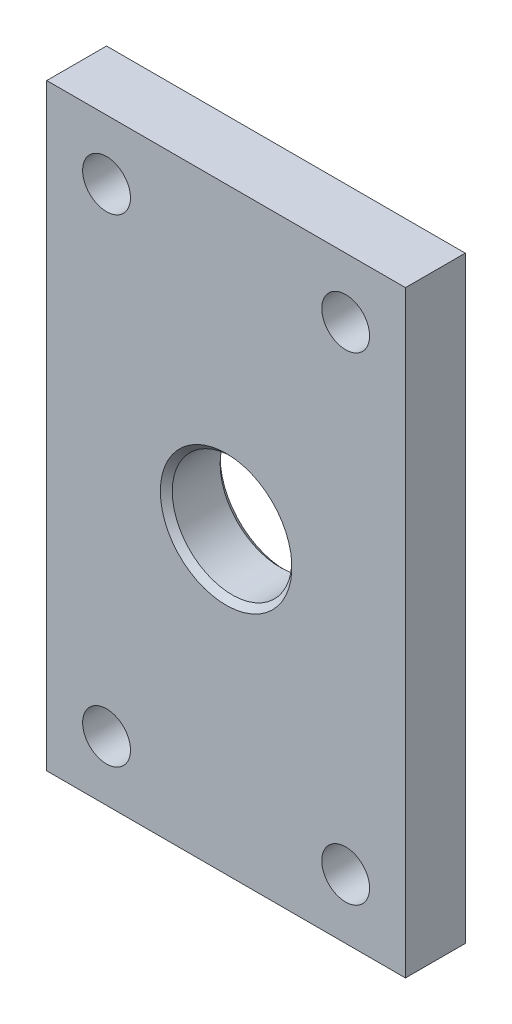
ISO-10303-21;
HEADER;
FILE_DESCRIPTION(('STEP AP214'),'2;1');
FILE_NAME('part.step','',(''),(''),'','','');
FILE_SCHEMA(('AUTOMOTIVE_DESIGN { 1 0 10303 214 1 1 1 1 }'));
ENDSEC;
DATA;
#1=APPLICATION_CONTEXT('core data for automotive mechanical design processes');
#2=APPLICATION_PROTOCOL_DEFINITION('international standard','automotive_design',2000,#1);
#3=PRODUCT_CONTEXT('',#1,'mechanical');
#4=PRODUCT('Part','Part','',(#3));
#5=PRODUCT_RELATED_PRODUCT_CATEGORY('part','',(#4));
#6=PRODUCT_DEFINITION_FORMATION('','',#4);
#7=PRODUCT_DEFINITION_CONTEXT('part definition',#1,'design');
#8=PRODUCT_DEFINITION('design','',#6,#7);
#9=PRODUCT_DEFINITION_SHAPE('','',#8);
#10=(LENGTH_UNIT() NAMED_UNIT(*) SI_UNIT(.MILLI.,.METRE.));
#11=(NAMED_UNIT(*) PLANE_ANGLE_UNIT() SI_UNIT($,.RADIAN.));
#12=(NAMED_UNIT(*) SI_UNIT($,.STERADIAN.) SOLID_ANGLE_UNIT());
#13=UNCERTAINTY_MEASURE_WITH_UNIT(LENGTH_MEASURE(1.E-05),#10,'distance_accuracy_value','');
#14=(GEOMETRIC_REPRESENTATION_CONTEXT(3) GLOBAL_UNCERTAINTY_ASSIGNED_CONTEXT((#13)) GLOBAL_UNIT_ASSIGNED_CONTEXT((#10,
#11,#12)) REPRESENTATION_CONTEXT('',''));
#15=CARTESIAN_POINT('',(0.,0.,0.));
#16=DIRECTION('',(0.,0.,1.));
#17=DIRECTION('',(1.,0.,0.));
#18=AXIS2_PLACEMENT_3D('',#15,#16,#17);
#19=CARTESIAN_POINT('',(30.,50.,5.));
#20=DIRECTION('',(0.,-1.,0.));
#21=DIRECTION('',(0.,0.,-1.));
#22=AXIS2_PLACEMENT_3D('',#19,#20,#21);
#23=PLANE('',#22);
#24=DIRECTION('',(-1.,0.,0.));
#25=VECTOR('',#24,1.);
#26=CARTESIAN_POINT('',(30.,50.,-5.));
#27=LINE('',#26,#25);
#28=CARTESIAN_POINT('',(30.,50.,-5.));
#29=VERTEX_POINT('',#28);
#30=CARTESIAN_POINT('',(-30.,50.,-5.));
#31=VERTEX_POINT('',#30);
#32=EDGE_CURVE('E114',#29,#31,#27,.T.);
#33=ORIENTED_EDGE('',*,*,#32,.T.);
#34=DIRECTION('',(0.,0.,-1.));
#35=VECTOR('',#34,1.);
#36=CARTESIAN_POINT('',(-30.,50.,5.));
#37=LINE('',#36,#35);
#38=CARTESIAN_POINT('',(-30.,50.,5.));
#39=VERTEX_POINT('',#38);
#40=EDGE_CURVE('E105',#39,#31,#37,.T.);
#41=ORIENTED_EDGE('',*,*,#40,.F.);
#42=DIRECTION('',(-1.,0.,0.));
#43=VECTOR('',#42,1.);
#44=CARTESIAN_POINT('',(30.,50.,5.));
#45=LINE('',#44,#43);
#46=CARTESIAN_POINT('',(30.,50.,5.));
#47=VERTEX_POINT('',#46);
#48=EDGE_CURVE('E99',#47,#39,#45,.T.);
#49=ORIENTED_EDGE('',*,*,#48,.F.);
#50=DIRECTION('',(0.,0.,-1.));
#51=VECTOR('',#50,1.);
#52=CARTESIAN_POINT('',(30.,50.,5.));
#53=LINE('',#52,#51);
#54=EDGE_CURVE('E110',#47,#29,#53,.T.);
#55=ORIENTED_EDGE('',*,*,#54,.T.);
#56=EDGE_LOOP('',(#33,#41,#49,#55));
#57=FACE_BOUND('',#56,.T.);
#58=ADVANCED_FACE('F45',(#57),#23,.F.);
#59=CARTESIAN_POINT('',(-30.,-50.,5.));
#60=DIRECTION('',(1.,0.,0.));
#61=DIRECTION('',(0.,0.,-1.));
#62=AXIS2_PLACEMENT_3D('',#59,#60,#61);
#63=PLANE('',#62);
#64=DIRECTION('',(0.,-1.,0.));
#65=VECTOR('',#64,1.);
#66=CARTESIAN_POINT('',(-30.,-50.,-5.));
#67=LINE('',#66,#65);
#68=CARTESIAN_POINT('',(-30.,-50.,-5.));
#69=VERTEX_POINT('',#68);
#70=EDGE_CURVE('E104',#31,#69,#67,.T.);
#71=ORIENTED_EDGE('',*,*,#70,.T.);
#72=DIRECTION('',(0.,0.,-1.));
#73=VECTOR('',#72,1.);
#74=CARTESIAN_POINT('',(-30.,-50.,5.));
#75=LINE('',#74,#73);
#76=CARTESIAN_POINT('',(-30.,-50.,5.));
#77=VERTEX_POINT('',#76);
#78=EDGE_CURVE('E102',#77,#69,#75,.T.);
#79=ORIENTED_EDGE('',*,*,#78,.F.);
#80=DIRECTION('',(0.,-1.,0.));
#81=VECTOR('',#80,1.);
#82=CARTESIAN_POINT('',(-30.,-50.,5.));
#83=LINE('',#82,#81);
#84=EDGE_CURVE('E94',#39,#77,#83,.T.);
#85=ORIENTED_EDGE('',*,*,#84,.F.);
#86=ORIENTED_EDGE('',*,*,#40,.T.);
#87=EDGE_LOOP('',(#71,#79,#85,#86));
#88=FACE_BOUND('',#87,.T.);
#89=ADVANCED_FACE('F103',(#88),#63,.F.);
#90=CARTESIAN_POINT('',(30.,-50.,5.));
#91=DIRECTION('',(0.,1.,0.));
#92=DIRECTION('',(0.,0.,1.));
#93=AXIS2_PLACEMENT_3D('',#90,#91,#92);
#94=PLANE('',#93);
#95=DIRECTION('',(1.,0.,0.));
#96=VECTOR('',#95,1.);
#97=CARTESIAN_POINT('',(30.,-50.,-5.));
#98=LINE('',#97,#96);
#99=CARTESIAN_POINT('',(30.,-50.,-5.));
#100=VERTEX_POINT('',#99);
#101=EDGE_CURVE('E80',#69,#100,#98,.T.);
#102=ORIENTED_EDGE('',*,*,#101,.T.);
#103=DIRECTION('',(0.,0.,-1.));
#104=VECTOR('',#103,1.);
#105=CARTESIAN_POINT('',(30.,-50.,5.));
#106=LINE('',#105,#104);
#107=CARTESIAN_POINT('',(30.,-50.,5.));
#108=VERTEX_POINT('',#107);
#109=EDGE_CURVE('E106',#108,#100,#106,.T.);
#110=ORIENTED_EDGE('',*,*,#109,.F.);
#111=DIRECTION('',(1.,0.,0.));
#112=VECTOR('',#111,1.);
#113=CARTESIAN_POINT('',(30.,-50.,5.));
#114=LINE('',#113,#112);
#115=EDGE_CURVE('E97',#77,#108,#114,.T.);
#116=ORIENTED_EDGE('',*,*,#115,.F.);
#117=ORIENTED_EDGE('',*,*,#78,.T.);
#118=EDGE_LOOP('',(#102,#110,#116,#117));
#119=FACE_BOUND('',#118,.T.);
#120=ADVANCED_FACE('F108',(#119),#94,.F.);
#121=CARTESIAN_POINT('',(30.,-50.,5.));
#122=DIRECTION('',(-1.,0.,0.));
#123=DIRECTION('',(0.,0.,1.));
#124=AXIS2_PLACEMENT_3D('',#121,#122,#123);
#125=PLANE('',#124);
#126=DIRECTION('',(0.,1.,0.));
#127=VECTOR('',#126,1.);
#128=CARTESIAN_POINT('',(30.,-50.,-5.));
#129=LINE('',#128,#127);
#130=EDGE_CURVE('E86',#100,#29,#129,.T.);
#131=ORIENTED_EDGE('',*,*,#130,.T.);
#132=ORIENTED_EDGE('',*,*,#54,.F.);
#133=DIRECTION('',(0.,1.,0.));
#134=VECTOR('',#133,1.);
#135=CARTESIAN_POINT('',(30.,-50.,5.));
#136=LINE('',#135,#134);
#137=EDGE_CURVE('E63',#108,#47,#136,.T.);
#138=ORIENTED_EDGE('',*,*,#137,.F.);
#139=ORIENTED_EDGE('',*,*,#109,.T.);
#140=EDGE_LOOP('',(#131,#132,#138,#139));
#141=FACE_BOUND('',#140,.T.);
#142=ADVANCED_FACE('F163',(#141),#125,.F.);
#143=CARTESIAN_POINT('',(0.,0.,5.));
#144=DIRECTION('',(0.,0.,-1.));
#145=DIRECTION('',(-1.,0.,0.));
#146=AXIS2_PLACEMENT_3D('',#143,#144,#145);
#147=PLANE('',#146);
#148=CARTESIAN_POINT('',(0.,0.,5.));
#149=DIRECTION('',(0.,0.,-1.));
#150=DIRECTION('',(-1.,0.,0.));
#151=AXIS2_PLACEMENT_3D('',#148,#149,#150);
#152=CIRCLE('',#151,11.);
#153=CARTESIAN_POINT('',(-11.,0.,5.));
#154=VERTEX_POINT('',#153);
#155=EDGE_CURVE('E11',#154,#154,#152,.T.);
#156=ORIENTED_EDGE('',*,*,#155,.T.);
#157=EDGE_LOOP('',(#156));
#158=FACE_BOUND('',#157,.T.);
#159=CARTESIAN_POINT('',(20.,40.,5.));
#160=DIRECTION('',(0.,0.,1.));
#161=DIRECTION('',(1.,0.,0.));
#162=AXIS2_PLACEMENT_3D('',#159,#160,#161);
#163=CIRCLE('',#162,4.);
#164=CARTESIAN_POINT('',(24.,40.,5.));
#165=VERTEX_POINT('',#164);
#166=EDGE_CURVE('E279',#165,#165,#163,.T.);
#167=ORIENTED_EDGE('',*,*,#166,.F.);
#168=EDGE_LOOP('',(#167));
#169=FACE_BOUND('',#168,.T.);
#170=CARTESIAN_POINT('',(-20.,-40.,5.));
#171=DIRECTION('',(0.,0.,1.));
#172=DIRECTION('',(1.,0.,0.));
#173=AXIS2_PLACEMENT_3D('',#170,#171,#172);
#174=CIRCLE('',#173,4.);
#175=CARTESIAN_POINT('',(-16.,-40.,5.));
#176=VERTEX_POINT('',#175);
#177=EDGE_CURVE('E283',#176,#176,#174,.T.);
#178=ORIENTED_EDGE('',*,*,#177,.F.);
#179=EDGE_LOOP('',(#178));
#180=FACE_BOUND('',#179,.T.);
#181=CARTESIAN_POINT('',(-20.,40.,5.));
#182=DIRECTION('',(0.,0.,1.));
#183=DIRECTION('',(1.,0.,0.));
#184=AXIS2_PLACEMENT_3D('',#181,#182,#183);
#185=CIRCLE('',#184,4.);
#186=CARTESIAN_POINT('',(-16.,40.,5.));
#187=VERTEX_POINT('',#186);
#188=EDGE_CURVE('E287',#187,#187,#185,.T.);
#189=ORIENTED_EDGE('',*,*,#188,.F.);
#190=EDGE_LOOP('',(#189));
#191=FACE_BOUND('',#190,.T.);
#192=CARTESIAN_POINT('',(20.,-40.,5.));
#193=DIRECTION('',(0.,0.,1.));
#194=DIRECTION('',(1.,0.,0.));
#195=AXIS2_PLACEMENT_3D('',#192,#193,#194);
#196=CIRCLE('',#195,4.);
#197=CARTESIAN_POINT('',(24.,-40.,5.));
#198=VERTEX_POINT('',#197);
#199=EDGE_CURVE('E117',#198,#198,#196,.T.);
#200=ORIENTED_EDGE('',*,*,#199,.F.);
#201=EDGE_LOOP('',(#200));
#202=FACE_BOUND('',#201,.T.);
#203=ORIENTED_EDGE('',*,*,#48,.T.);
#204=ORIENTED_EDGE('',*,*,#84,.T.);
#205=ORIENTED_EDGE('',*,*,#115,.T.);
#206=ORIENTED_EDGE('',*,*,#137,.T.);
#207=EDGE_LOOP('',(#203,#204,#205,#206));
#208=FACE_BOUND('',#207,.T.);
#209=ADVANCED_FACE('F95',(#158,#169,#180,#191,#202,#208),#147,.F.);
#210=CARTESIAN_POINT('',(0.,0.,-5.));
#211=DIRECTION('',(0.,0.,-1.));
#212=DIRECTION('',(-1.,0.,0.));
#213=AXIS2_PLACEMENT_3D('',#210,#211,#212);
#214=PLANE('',#213);
#215=CARTESIAN_POINT('',(0.,0.,-5.));
#216=DIRECTION('',(0.,0.,-1.));
#217=DIRECTION('',(-1.,0.,0.));
#218=AXIS2_PLACEMENT_3D('',#215,#216,#217);
#219=CIRCLE('',#218,11.);
#220=CARTESIAN_POINT('',(-11.,0.,-5.));
#221=VERTEX_POINT('',#220);
#222=EDGE_CURVE('E124',#221,#221,#219,.F.);
#223=ORIENTED_EDGE('',*,*,#222,.T.);
#224=EDGE_LOOP('',(#223));
#225=FACE_BOUND('',#224,.T.);
#226=CARTESIAN_POINT('',(20.,40.,-5.));
#227=DIRECTION('',(0.,0.,-1.));
#228=DIRECTION('',(-1.,0.,0.));
#229=AXIS2_PLACEMENT_3D('',#226,#227,#228);
#230=CIRCLE('',#229,4.);
#231=CARTESIAN_POINT('',(16.,40.,-5.));
#232=VERTEX_POINT('',#231);
#233=EDGE_CURVE('E148',#232,#232,#230,.F.);
#234=ORIENTED_EDGE('',*,*,#233,.T.);
#235=EDGE_LOOP('',(#234));
#236=FACE_BOUND('',#235,.T.);
#237=CARTESIAN_POINT('',(-20.,-40.,-5.));
#238=DIRECTION('',(0.,0.,-1.));
#239=DIRECTION('',(-1.,0.,0.));
#240=AXIS2_PLACEMENT_3D('',#237,#238,#239);
#241=CIRCLE('',#240,4.);
#242=CARTESIAN_POINT('',(-24.,-40.,-5.));
#243=VERTEX_POINT('',#242);
#244=EDGE_CURVE('E152',#243,#243,#241,.F.);
#245=ORIENTED_EDGE('',*,*,#244,.T.);
#246=EDGE_LOOP('',(#245));
#247=FACE_BOUND('',#246,.T.);
#248=CARTESIAN_POINT('',(-20.,40.,-5.));
#249=DIRECTION('',(0.,0.,-1.));
#250=DIRECTION('',(-1.,0.,0.));
#251=AXIS2_PLACEMENT_3D('',#248,#249,#250);
#252=CIRCLE('',#251,4.);
#253=CARTESIAN_POINT('',(-24.,40.,-5.));
#254=VERTEX_POINT('',#253);
#255=EDGE_CURVE('E156',#254,#254,#252,.F.);
#256=ORIENTED_EDGE('',*,*,#255,.T.);
#257=EDGE_LOOP('',(#256));
#258=FACE_BOUND('',#257,.T.);
#259=CARTESIAN_POINT('',(20.,-40.,-5.));
#260=DIRECTION('',(0.,0.,-1.));
#261=DIRECTION('',(-1.,0.,0.));
#262=AXIS2_PLACEMENT_3D('',#259,#260,#261);
#263=CIRCLE('',#262,4.);
#264=CARTESIAN_POINT('',(16.,-40.,-5.));
#265=VERTEX_POINT('',#264);
#266=EDGE_CURVE('E160',#265,#265,#263,.F.);
#267=ORIENTED_EDGE('',*,*,#266,.T.);
#268=EDGE_LOOP('',(#267));
#269=FACE_BOUND('',#268,.T.);
#270=ORIENTED_EDGE('',*,*,#32,.F.);
#271=ORIENTED_EDGE('',*,*,#130,.F.);
#272=ORIENTED_EDGE('',*,*,#101,.F.);
#273=ORIENTED_EDGE('',*,*,#70,.F.);
#274=EDGE_LOOP('',(#270,#271,#272,#273));
#275=FACE_BOUND('',#274,.T.);
#276=ADVANCED_FACE('F140',(#225,#236,#247,#258,#269,#275),#214,.T.);
#277=CARTESIAN_POINT('',(20.,-40.,-5.001));
#278=DIRECTION('',(0.,0.,1.));
#279=DIRECTION('',(1.,0.,0.));
#280=AXIS2_PLACEMENT_3D('',#277,#278,#279);
#281=CYLINDRICAL_SURFACE('',#280,4.);
#282=ORIENTED_EDGE('',*,*,#266,.F.);
#283=EDGE_LOOP('',(#282));
#284=FACE_BOUND('',#283,.T.);
#285=ORIENTED_EDGE('',*,*,#199,.T.);
#286=EDGE_LOOP('',(#285));
#287=FACE_BOUND('',#286,.T.);
#288=ADVANCED_FACE('F143',(#284,#287),#281,.F.);
#289=CARTESIAN_POINT('',(-20.,40.,-5.001));
#290=DIRECTION('',(0.,0.,1.));
#291=DIRECTION('',(1.,0.,0.));
#292=AXIS2_PLACEMENT_3D('',#289,#290,#291);
#293=CYLINDRICAL_SURFACE('',#292,4.);
#294=ORIENTED_EDGE('',*,*,#255,.F.);
#295=EDGE_LOOP('',(#294));
#296=FACE_BOUND('',#295,.T.);
#297=ORIENTED_EDGE('',*,*,#188,.T.);
#298=EDGE_LOOP('',(#297));
#299=FACE_BOUND('',#298,.T.);
#300=ADVANCED_FACE('F219',(#296,#299),#293,.F.);
#301=CARTESIAN_POINT('',(-20.,-40.,-5.001));
#302=DIRECTION('',(0.,0.,1.));
#303=DIRECTION('',(1.,0.,0.));
#304=AXIS2_PLACEMENT_3D('',#301,#302,#303);
#305=CYLINDRICAL_SURFACE('',#304,4.);
#306=ORIENTED_EDGE('',*,*,#244,.F.);
#307=EDGE_LOOP('',(#306));
#308=FACE_BOUND('',#307,.T.);
#309=ORIENTED_EDGE('',*,*,#177,.T.);
#310=EDGE_LOOP('',(#309));
#311=FACE_BOUND('',#310,.T.);
#312=ADVANCED_FACE('F229',(#308,#311),#305,.F.);
#313=CARTESIAN_POINT('',(20.,40.,-5.001));
#314=DIRECTION('',(0.,0.,1.));
#315=DIRECTION('',(1.,0.,0.));
#316=AXIS2_PLACEMENT_3D('',#313,#314,#315);
#317=CYLINDRICAL_SURFACE('',#316,4.);
#318=ORIENTED_EDGE('',*,*,#233,.F.);
#319=EDGE_LOOP('',(#318));
#320=FACE_BOUND('',#319,.T.);
#321=ORIENTED_EDGE('',*,*,#166,.T.);
#322=EDGE_LOOP('',(#321));
#323=FACE_BOUND('',#322,.T.);
#324=ADVANCED_FACE('F239',(#320,#323),#317,.F.);
#325=CARTESIAN_POINT('',(0.,0.,-5.001));
#326=DIRECTION('',(0.,0.,1.));
#327=DIRECTION('',(1.,0.,0.));
#328=AXIS2_PLACEMENT_3D('',#325,#326,#327);
#329=CYLINDRICAL_SURFACE('',#328,10.);
#330=CARTESIAN_POINT('',(0.,0.,-3.99999999999998));
#331=DIRECTION('',(0.,0.,-1.));
#332=DIRECTION('',(-1.,0.,0.));
#333=AXIS2_PLACEMENT_3D('',#330,#331,#332);
#334=CIRCLE('',#333,10.);
#335=CARTESIAN_POINT('',(-10.,0.,-3.99999999999998));
#336=VERTEX_POINT('',#335);
#337=EDGE_CURVE('E55',#336,#336,#334,.T.);
#338=ORIENTED_EDGE('',*,*,#337,.T.);
#339=EDGE_LOOP('',(#338));
#340=FACE_BOUND('',#339,.T.);
#341=CARTESIAN_POINT('',(0.,0.,4.));
#342=DIRECTION('',(0.,0.,-1.));
#343=DIRECTION('',(-1.,0.,0.));
#344=AXIS2_PLACEMENT_3D('',#341,#342,#343);
#345=CIRCLE('',#344,10.);
#346=CARTESIAN_POINT('',(-10.,0.,4.));
#347=VERTEX_POINT('',#346);
#348=EDGE_CURVE('E127',#347,#347,#345,.F.);
#349=ORIENTED_EDGE('',*,*,#348,.T.);
#350=EDGE_LOOP('',(#349));
#351=FACE_BOUND('',#350,.T.);
#352=ADVANCED_FACE('F132',(#340,#351),#329,.F.);
#353=CARTESIAN_POINT('',(0.,0.,-5.));
#354=DIRECTION('',(0.,0.,-1.));
#355=DIRECTION('',(-1.,0.,0.));
#356=AXIS2_PLACEMENT_3D('',#353,#354,#355);
#357=CONICAL_SURFACE('',#356,11.,0.785398163397441);
#358=ORIENTED_EDGE('',*,*,#337,.F.);
#359=EDGE_LOOP('',(#358));
#360=FACE_BOUND('',#359,.T.);
#361=ORIENTED_EDGE('',*,*,#222,.F.);
#362=EDGE_LOOP('',(#361));
#363=FACE_BOUND('',#362,.T.);
#364=ADVANCED_FACE('F135',(#360,#363),#357,.F.);
#365=CARTESIAN_POINT('',(0.,0.,4.));
#366=DIRECTION('',(0.,0.,1.));
#367=DIRECTION('',(1.,0.,0.));
#368=AXIS2_PLACEMENT_3D('',#365,#366,#367);
#369=CONICAL_SURFACE('',#368,10.,0.785398163397455);
#370=ORIENTED_EDGE('',*,*,#155,.F.);
#371=EDGE_LOOP('',(#370));
#372=FACE_BOUND('',#371,.T.);
#373=ORIENTED_EDGE('',*,*,#348,.F.);
#374=EDGE_LOOP('',(#373));
#375=FACE_BOUND('',#374,.T.);
#376=ADVANCED_FACE('F48',(#372,#375),#369,.F.);
#377=CLOSED_SHELL('',(#58,#89,#120,#142,#209,#276,#288,#300,#312,#324,#352,#364,#376));
#378=MANIFOLD_SOLID_BREP('B2',#377);
#379=ADVANCED_BREP_SHAPE_REPRESENTATION('',(#18,#378),#14);
#380=SHAPE_DEFINITION_REPRESENTATION(#9,#379);
ENDSEC;
END-ISO-10303-21;
